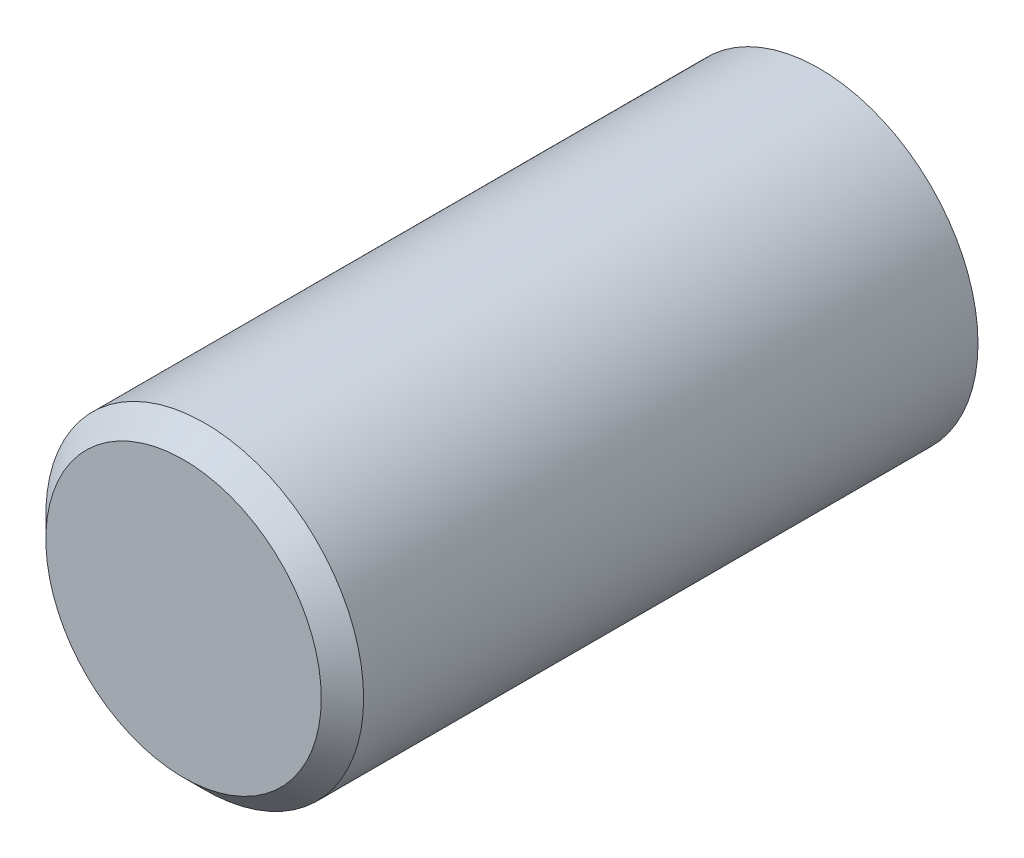
ISO-10303-21;
HEADER;
FILE_DESCRIPTION(('STEP AP214'),'2;1');
FILE_NAME('part.step','',(''),(''),'','','');
FILE_SCHEMA(('AUTOMOTIVE_DESIGN { 1 0 10303 214 1 1 1 1 }'));
ENDSEC;
DATA;
#1=APPLICATION_CONTEXT('core data for automotive mechanical design processes');
#2=APPLICATION_PROTOCOL_DEFINITION('international standard','automotive_design',2000,#1);
#3=PRODUCT_CONTEXT('',#1,'mechanical');
#4=PRODUCT('Part','Part','',(#3));
#5=PRODUCT_RELATED_PRODUCT_CATEGORY('part','',(#4));
#6=PRODUCT_DEFINITION_FORMATION('','',#4);
#7=PRODUCT_DEFINITION_CONTEXT('part definition',#1,'design');
#8=PRODUCT_DEFINITION('design','',#6,#7);
#9=PRODUCT_DEFINITION_SHAPE('','',#8);
#10=(LENGTH_UNIT() NAMED_UNIT(*) SI_UNIT(.MILLI.,.METRE.));
#11=(NAMED_UNIT(*) PLANE_ANGLE_UNIT() SI_UNIT($,.RADIAN.));
#12=(NAMED_UNIT(*) SI_UNIT($,.STERADIAN.) SOLID_ANGLE_UNIT());
#13=UNCERTAINTY_MEASURE_WITH_UNIT(LENGTH_MEASURE(1.E-05),#10,'distance_accuracy_value','');
#14=(GEOMETRIC_REPRESENTATION_CONTEXT(3) GLOBAL_UNCERTAINTY_ASSIGNED_CONTEXT((#13)) GLOBAL_UNIT_ASSIGNED_CONTEXT((#10,
#11,#12)) REPRESENTATION_CONTEXT('',''));
#15=CARTESIAN_POINT('',(0.,0.,0.));
#16=DIRECTION('',(0.,0.,1.));
#17=DIRECTION('',(1.,0.,0.));
#18=AXIS2_PLACEMENT_3D('',#15,#16,#17);
#19=CARTESIAN_POINT('',(0.,0.,6.));
#20=DIRECTION('',(0.,0.,-1.));
#21=DIRECTION('',(-1.,0.,0.));
#22=AXIS2_PLACEMENT_3D('',#19,#20,#21);
#23=CYLINDRICAL_SURFACE('',#22,1.5);
#24=CARTESIAN_POINT('',(0.,0.,5.8));
#25=DIRECTION('',(0.,0.,1.));
#26=DIRECTION('',(1.,0.,0.));
#27=AXIS2_PLACEMENT_3D('',#24,#25,#26);
#28=CIRCLE('',#27,1.5);
#29=CARTESIAN_POINT('',(1.5,0.,5.8));
#30=VERTEX_POINT('',#29);
#31=EDGE_CURVE('E10',#30,#30,#28,.F.);
#32=ORIENTED_EDGE('',*,*,#31,.T.);
#33=EDGE_LOOP('',(#32));
#34=FACE_BOUND('',#33,.T.);
#35=CARTESIAN_POINT('',(0.,0.,0.));
#36=DIRECTION('',(0.,0.,1.));
#37=DIRECTION('',(1.,0.,0.));
#38=AXIS2_PLACEMENT_3D('',#35,#36,#37);
#39=CIRCLE('',#38,1.5);
#40=CARTESIAN_POINT('',(1.5,0.,0.));
#41=VERTEX_POINT('',#40);
#42=EDGE_CURVE('E55',#41,#41,#39,.T.);
#43=ORIENTED_EDGE('',*,*,#42,.T.);
#44=EDGE_LOOP('',(#43));
#45=FACE_BOUND('',#44,.T.);
#46=ADVANCED_FACE('F43',(#34,#45),#23,.T.);
#47=CARTESIAN_POINT('',(0.,0.,6.));
#48=DIRECTION('',(0.,0.,1.));
#49=DIRECTION('',(1.,0.,0.));
#50=AXIS2_PLACEMENT_3D('',#47,#48,#49);
#51=PLANE('',#50);
#52=CARTESIAN_POINT('',(0.,0.,6.));
#53=DIRECTION('',(0.,0.,1.));
#54=DIRECTION('',(1.,0.,0.));
#55=AXIS2_PLACEMENT_3D('',#52,#53,#54);
#56=CIRCLE('',#55,1.3);
#57=CARTESIAN_POINT('',(1.3,0.,6.));
#58=VERTEX_POINT('',#57);
#59=EDGE_CURVE('E51',#58,#58,#56,.T.);
#60=ORIENTED_EDGE('',*,*,#59,.T.);
#61=EDGE_LOOP('',(#60));
#62=FACE_BOUND('',#61,.T.);
#63=ADVANCED_FACE('F65',(#62),#51,.T.);
#64=CARTESIAN_POINT('',(0.,0.,0.));
#65=DIRECTION('',(0.,0.,1.));
#66=DIRECTION('',(1.,0.,0.));
#67=AXIS2_PLACEMENT_3D('',#64,#65,#66);
#68=PLANE('',#67);
#69=ORIENTED_EDGE('',*,*,#42,.F.);
#70=EDGE_LOOP('',(#69));
#71=FACE_BOUND('',#70,.T.);
#72=ADVANCED_FACE('F63',(#71),#68,.F.);
#73=CARTESIAN_POINT('',(0.,0.,6.));
#74=DIRECTION('',(0.,0.,-1.));
#75=DIRECTION('',(-1.,0.,0.));
#76=AXIS2_PLACEMENT_3D('',#73,#74,#75);
#77=CONICAL_SURFACE('',#76,1.3,0.785398163397448);
#78=ORIENTED_EDGE('',*,*,#31,.F.);
#79=EDGE_LOOP('',(#78));
#80=FACE_BOUND('',#79,.T.);
#81=ORIENTED_EDGE('',*,*,#59,.F.);
#82=EDGE_LOOP('',(#81));
#83=FACE_BOUND('',#82,.T.);
#84=ADVANCED_FACE('F46',(#80,#83),#77,.T.);
#85=CLOSED_SHELL('',(#46,#63,#72,#84));
#86=MANIFOLD_SOLID_BREP('B2',#85);
#87=ADVANCED_BREP_SHAPE_REPRESENTATION('',(#18,#86),#14);
#88=SHAPE_DEFINITION_REPRESENTATION(#9,#87);
ENDSEC;
END-ISO-10303-21;
